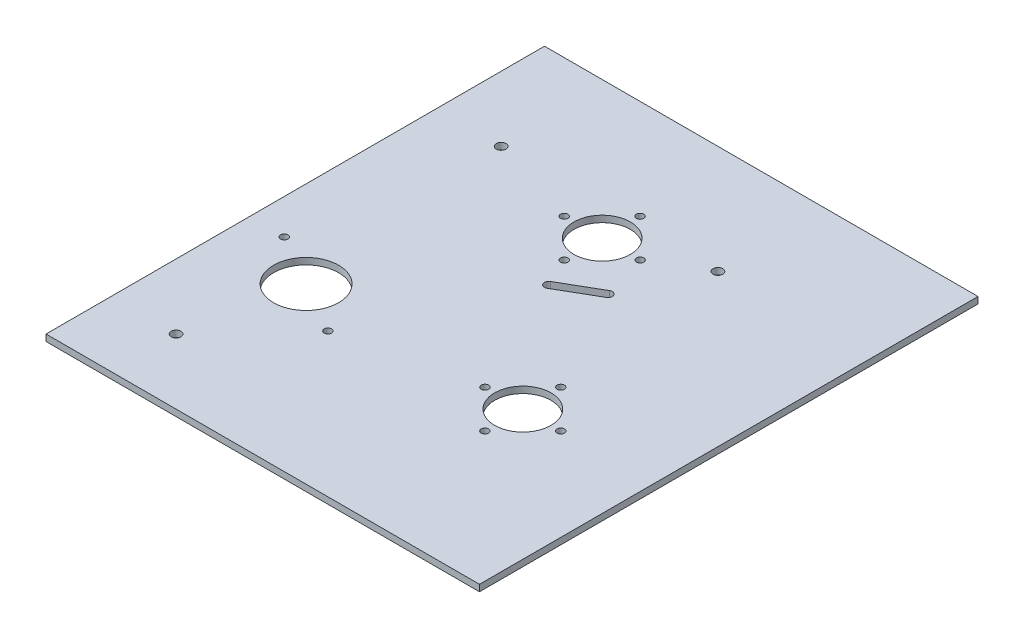
ISO-10303-21;
HEADER;
FILE_DESCRIPTION(('STEP AP214'),'2;1');
FILE_NAME('part.step','',(''),(''),'','','');
FILE_SCHEMA(('AUTOMOTIVE_DESIGN { 1 0 10303 214 1 1 1 1 }'));
ENDSEC;
DATA;
#1=APPLICATION_CONTEXT('core data for automotive mechanical design processes');
#2=APPLICATION_PROTOCOL_DEFINITION('international standard','automotive_design',2000,#1);
#3=PRODUCT_CONTEXT('',#1,'mechanical');
#4=PRODUCT('Part','Part','',(#3));
#5=PRODUCT_RELATED_PRODUCT_CATEGORY('part','',(#4));
#6=PRODUCT_DEFINITION_FORMATION('','',#4);
#7=PRODUCT_DEFINITION_CONTEXT('part definition',#1,'design');
#8=PRODUCT_DEFINITION('design','',#6,#7);
#9=PRODUCT_DEFINITION_SHAPE('','',#8);
#10=(LENGTH_UNIT() NAMED_UNIT(*) SI_UNIT(.MILLI.,.METRE.));
#11=(NAMED_UNIT(*) PLANE_ANGLE_UNIT() SI_UNIT($,.RADIAN.));
#12=(NAMED_UNIT(*) SI_UNIT($,.STERADIAN.) SOLID_ANGLE_UNIT());
#13=UNCERTAINTY_MEASURE_WITH_UNIT(LENGTH_MEASURE(1.E-05),#10,'distance_accuracy_value','');
#14=(GEOMETRIC_REPRESENTATION_CONTEXT(3) GLOBAL_UNCERTAINTY_ASSIGNED_CONTEXT((#13)) GLOBAL_UNIT_ASSIGNED_CONTEXT((#10,
#11,#12)) REPRESENTATION_CONTEXT('',''));
#15=CARTESIAN_POINT('',(0.,0.,0.));
#16=DIRECTION('',(0.,0.,1.));
#17=DIRECTION('',(1.,0.,0.));
#18=AXIS2_PLACEMENT_3D('',#15,#16,#17);
#19=CARTESIAN_POINT('',(0.,3.,0.));
#20=DIRECTION('',(0.,-1.,0.));
#21=DIRECTION('',(0.,0.,-1.));
#22=AXIS2_PLACEMENT_3D('',#19,#20,#21);
#23=PLANE('',#22);
#24=CARTESIAN_POINT('',(30.,3.,0.));
#25=DIRECTION('',(0.,1.,0.));
#26=DIRECTION('',(0.,0.,1.));
#27=AXIS2_PLACEMENT_3D('',#24,#25,#26);
#28=CIRCLE('',#27,2.24999999999999);
#29=CARTESIAN_POINT('',(30.,3.,2.24999999999999));
#30=VERTEX_POINT('',#29);
#31=EDGE_CURVE('E325',#30,#30,#28,.T.);
#32=ORIENTED_EDGE('',*,*,#31,.F.);
#33=EDGE_LOOP('',(#32));
#34=FACE_BOUND('',#33,.T.);
#35=CARTESIAN_POINT('',(16.1843013959279,3.,-63.75));
#36=DIRECTION('',(0.,1.,0.));
#37=DIRECTION('',(0.,0.,1.));
#38=AXIS2_PLACEMENT_3D('',#35,#36,#37);
#39=CIRCLE('',#38,1.69999999999999);
#40=CARTESIAN_POINT('',(16.1843013959279,3.,-62.05));
#41=VERTEX_POINT('',#40);
#42=EDGE_CURVE('E140',#41,#41,#39,.T.);
#43=ORIENTED_EDGE('',*,*,#42,.F.);
#44=EDGE_LOOP('',(#43));
#45=FACE_BOUND('',#44,.T.);
#46=CARTESIAN_POINT('',(63.8156986040721,3.,-36.25));
#47=DIRECTION('',(0.,1.,0.));
#48=DIRECTION('',(0.,0.,1.));
#49=AXIS2_PLACEMENT_3D('',#46,#47,#48);
#50=CIRCLE('',#49,1.69999999999999);
#51=CARTESIAN_POINT('',(63.8156986040721,3.,-34.55));
#52=VERTEX_POINT('',#51);
#53=EDGE_CURVE('E148',#52,#52,#50,.T.);
#54=ORIENTED_EDGE('',*,*,#53,.F.);
#55=EDGE_LOOP('',(#54));
#56=FACE_BOUND('',#55,.T.);
#57=CARTESIAN_POINT('',(140.,3.,-67.5));
#58=DIRECTION('',(0.,1.,0.));
#59=DIRECTION('',(0.,0.,1.));
#60=AXIS2_PLACEMENT_3D('',#57,#58,#59);
#61=CIRCLE('',#60,1.69999999999998);
#62=CARTESIAN_POINT('',(140.,3.,-65.8));
#63=VERTEX_POINT('',#62);
#64=EDGE_CURVE('E156',#63,#63,#61,.T.);
#65=ORIENTED_EDGE('',*,*,#64,.F.);
#66=EDGE_LOOP('',(#65));
#67=FACE_BOUND('',#66,.T.);
#68=CARTESIAN_POINT('',(122.5,3.,-50.));
#69=DIRECTION('',(0.,1.,0.));
#70=DIRECTION('',(0.,0.,1.));
#71=AXIS2_PLACEMENT_3D('',#68,#69,#70);
#72=CIRCLE('',#71,1.69999999999999);
#73=CARTESIAN_POINT('',(122.5,3.,-48.3));
#74=VERTEX_POINT('',#73);
#75=EDGE_CURVE('E164',#74,#74,#72,.T.);
#76=ORIENTED_EDGE('',*,*,#75,.F.);
#77=EDGE_LOOP('',(#76));
#78=FACE_BOUND('',#77,.T.);
#79=CARTESIAN_POINT('',(157.5,3.,-50.));
#80=DIRECTION('',(0.,1.,0.));
#81=DIRECTION('',(0.,0.,1.));
#82=AXIS2_PLACEMENT_3D('',#79,#80,#81);
#83=CIRCLE('',#82,1.69999999999998);
#84=CARTESIAN_POINT('',(157.5,3.,-48.3));
#85=VERTEX_POINT('',#84);
#86=EDGE_CURVE('E172',#85,#85,#83,.T.);
#87=ORIENTED_EDGE('',*,*,#86,.F.);
#88=EDGE_LOOP('',(#87));
#89=FACE_BOUND('',#88,.T.);
#90=CARTESIAN_POINT('',(140.,3.,-32.5));
#91=DIRECTION('',(0.,1.,0.));
#92=DIRECTION('',(0.,0.,1.));
#93=AXIS2_PLACEMENT_3D('',#90,#91,#92);
#94=CIRCLE('',#93,1.69999999999998);
#95=CARTESIAN_POINT('',(140.,3.,-30.8));
#96=VERTEX_POINT('',#95);
#97=EDGE_CURVE('E180',#96,#96,#94,.T.);
#98=ORIENTED_EDGE('',*,*,#97,.F.);
#99=EDGE_LOOP('',(#98));
#100=FACE_BOUND('',#99,.T.);
#101=CARTESIAN_POINT('',(90.,3.,-119.102540378444));
#102=DIRECTION('',(0.,1.,0.));
#103=DIRECTION('',(0.,0.,1.));
#104=AXIS2_PLACEMENT_3D('',#101,#102,#103);
#105=CIRCLE('',#104,1.69999999999999);
#106=CARTESIAN_POINT('',(90.,3.,-117.402540378444));
#107=VERTEX_POINT('',#106);
#108=EDGE_CURVE('E188',#107,#107,#105,.T.);
#109=ORIENTED_EDGE('',*,*,#108,.F.);
#110=EDGE_LOOP('',(#109));
#111=FACE_BOUND('',#110,.T.);
#112=CARTESIAN_POINT('',(72.5,3.,-136.602540378444));
#113=DIRECTION('',(0.,1.,0.));
#114=DIRECTION('',(0.,0.,1.));
#115=AXIS2_PLACEMENT_3D('',#112,#113,#114);
#116=CIRCLE('',#115,1.69999999999999);
#117=CARTESIAN_POINT('',(72.5,3.,-134.902540378444));
#118=VERTEX_POINT('',#117);
#119=EDGE_CURVE('E196',#118,#118,#116,.T.);
#120=ORIENTED_EDGE('',*,*,#119,.F.);
#121=EDGE_LOOP('',(#120));
#122=FACE_BOUND('',#121,.T.);
#123=CARTESIAN_POINT('',(107.5,3.,-136.602540378444));
#124=DIRECTION('',(0.,1.,0.));
#125=DIRECTION('',(0.,0.,1.));
#126=AXIS2_PLACEMENT_3D('',#123,#124,#125);
#127=CIRCLE('',#126,1.69999999999999);
#128=CARTESIAN_POINT('',(107.5,3.,-134.902540378444));
#129=VERTEX_POINT('',#128);
#130=EDGE_CURVE('E204',#129,#129,#127,.T.);
#131=ORIENTED_EDGE('',*,*,#130,.F.);
#132=EDGE_LOOP('',(#131));
#133=FACE_BOUND('',#132,.T.);
#134=CARTESIAN_POINT('',(90.,3.,-154.102540378444));
#135=DIRECTION('',(0.,1.,0.));
#136=DIRECTION('',(0.,0.,1.));
#137=AXIS2_PLACEMENT_3D('',#134,#135,#136);
#138=CIRCLE('',#137,1.69999999999999);
#139=CARTESIAN_POINT('',(90.,3.,-152.402540378444));
#140=VERTEX_POINT('',#139);
#141=EDGE_CURVE('E212',#140,#140,#138,.T.);
#142=ORIENTED_EDGE('',*,*,#141,.F.);
#143=EDGE_LOOP('',(#142));
#144=FACE_BOUND('',#143,.T.);
#145=CARTESIAN_POINT('',(90.,3.,-136.602540378444));
#146=DIRECTION('',(0.,1.,0.));
#147=DIRECTION('',(0.,0.,1.));
#148=AXIS2_PLACEMENT_3D('',#145,#146,#147);
#149=CIRCLE('',#148,13.);
#150=CARTESIAN_POINT('',(90.,3.,-123.602540378444));
#151=VERTEX_POINT('',#150);
#152=EDGE_CURVE('E225',#151,#151,#149,.T.);
#153=ORIENTED_EDGE('',*,*,#152,.F.);
#154=EDGE_LOOP('',(#153));
#155=FACE_BOUND('',#154,.T.);
#156=CARTESIAN_POINT('',(140.,3.,-50.));
#157=DIRECTION('',(0.,1.,0.));
#158=DIRECTION('',(0.,0.,1.));
#159=AXIS2_PLACEMENT_3D('',#156,#157,#158);
#160=CIRCLE('',#159,13.);
#161=CARTESIAN_POINT('',(140.,3.,-37.));
#162=VERTEX_POINT('',#161);
#163=EDGE_CURVE('E233',#162,#162,#160,.T.);
#164=ORIENTED_EDGE('',*,*,#163,.F.);
#165=EDGE_LOOP('',(#164));
#166=FACE_BOUND('',#165,.T.);
#167=DIRECTION('',(0.866025403784438,0.,-0.500000000000001));
#168=VECTOR('',#167,1.);
#169=CARTESIAN_POINT('',(97.3397459621556,3.,-103.889727457342));
#170=LINE('',#169,#168);
#171=CARTESIAN_POINT('',(97.3397459621556,3.,-103.889727457342));
#172=VERTEX_POINT('',#171);
#173=CARTESIAN_POINT('',(114.660254037844,3.,-113.889727457342));
#174=VERTEX_POINT('',#173);
#175=EDGE_CURVE('E256',#172,#174,#170,.T.);
#176=ORIENTED_EDGE('',*,*,#175,.F.);
#177=CARTESIAN_POINT('',(96.3397459621556,3.,-105.621778264911));
#178=DIRECTION('',(0.,1.,0.));
#179=DIRECTION('',(0.,0.,1.));
#180=AXIS2_PLACEMENT_3D('',#177,#178,#179);
#181=CIRCLE('',#180,2.00000000000001);
#182=CARTESIAN_POINT('',(95.3397459621556,3.,-107.35382907248));
#183=VERTEX_POINT('',#182);
#184=EDGE_CURVE('E55',#183,#172,#181,.T.);
#185=ORIENTED_EDGE('',*,*,#184,.F.);
#186=DIRECTION('',(-0.866025403784438,0.,0.5));
#187=VECTOR('',#186,1.);
#188=CARTESIAN_POINT('',(95.3397459621556,3.,-107.35382907248));
#189=LINE('',#188,#187);
#190=CARTESIAN_POINT('',(112.660254037844,3.,-117.35382907248));
#191=VERTEX_POINT('',#190);
#192=EDGE_CURVE('E243',#191,#183,#189,.T.);
#193=ORIENTED_EDGE('',*,*,#192,.F.);
#194=CARTESIAN_POINT('',(113.660254037844,3.,-115.621778264911));
#195=DIRECTION('',(0.,1.,0.));
#196=DIRECTION('',(0.,0.,1.));
#197=AXIS2_PLACEMENT_3D('',#194,#195,#196);
#198=CIRCLE('',#197,2.00000000000001);
#199=EDGE_CURVE('E261',#174,#191,#198,.T.);
#200=ORIENTED_EDGE('',*,*,#199,.F.);
#201=EDGE_LOOP('',(#176,#185,#193,#200));
#202=FACE_BOUND('',#201,.T.);
#203=CARTESIAN_POINT('',(40.,3.,-50.));
#204=DIRECTION('',(0.,1.,0.));
#205=DIRECTION('',(0.,0.,1.));
#206=AXIS2_PLACEMENT_3D('',#203,#204,#205);
#207=CIRCLE('',#206,15.);
#208=CARTESIAN_POINT('',(40.,3.,-35.));
#209=VERTEX_POINT('',#208);
#210=EDGE_CURVE('E220',#209,#209,#207,.T.);
#211=ORIENTED_EDGE('',*,*,#210,.F.);
#212=EDGE_LOOP('',(#211));
#213=FACE_BOUND('',#212,.T.);
#214=DIRECTION('',(0.,0.,1.));
#215=VECTOR('',#214,1.);
#216=CARTESIAN_POINT('',(0.,3.,0.));
#217=LINE('',#216,#215);
#218=CARTESIAN_POINT('',(0.,3.,-200.));
#219=VERTEX_POINT('',#218);
#220=CARTESIAN_POINT('',(0.,3.,30.));
#221=VERTEX_POINT('',#220);
#222=EDGE_CURVE('E284',#219,#221,#217,.T.);
#223=ORIENTED_EDGE('',*,*,#222,.T.);
#224=DIRECTION('',(1.,0.,0.));
#225=VECTOR('',#224,1.);
#226=CARTESIAN_POINT('',(0.,3.,30.));
#227=LINE('',#226,#225);
#228=CARTESIAN_POINT('',(200.,3.,30.));
#229=VERTEX_POINT('',#228);
#230=EDGE_CURVE('E131',#221,#229,#227,.T.);
#231=ORIENTED_EDGE('',*,*,#230,.T.);
#232=DIRECTION('',(0.,0.,-1.));
#233=VECTOR('',#232,1.);
#234=CARTESIAN_POINT('',(200.,3.,0.));
#235=LINE('',#234,#233);
#236=CARTESIAN_POINT('',(200.,3.,-200.));
#237=VERTEX_POINT('',#236);
#238=EDGE_CURVE('E121',#229,#237,#235,.T.);
#239=ORIENTED_EDGE('',*,*,#238,.T.);
#240=DIRECTION('',(-1.,0.,0.));
#241=VECTOR('',#240,1.);
#242=CARTESIAN_POINT('',(0.,3.,-200.));
#243=LINE('',#242,#241);
#244=EDGE_CURVE('E289',#237,#219,#243,.T.);
#245=ORIENTED_EDGE('',*,*,#244,.T.);
#246=EDGE_LOOP('',(#223,#231,#239,#245));
#247=FACE_BOUND('',#246,.T.);
#248=CARTESIAN_POINT('',(130.,3.,-150.));
#249=DIRECTION('',(0.,1.,0.));
#250=DIRECTION('',(0.,0.,1.));
#251=AXIS2_PLACEMENT_3D('',#248,#249,#250);
#252=CIRCLE('',#251,2.25);
#253=CARTESIAN_POINT('',(130.,3.,-147.75));
#254=VERTEX_POINT('',#253);
#255=EDGE_CURVE('E311',#254,#254,#252,.T.);
#256=ORIENTED_EDGE('',*,*,#255,.F.);
#257=EDGE_LOOP('',(#256));
#258=FACE_BOUND('',#257,.T.);
#259=CARTESIAN_POINT('',(30.,3.,-150.));
#260=DIRECTION('',(0.,1.,0.));
#261=DIRECTION('',(0.,0.,1.));
#262=AXIS2_PLACEMENT_3D('',#259,#260,#261);
#263=CIRCLE('',#262,2.24999999999999);
#264=CARTESIAN_POINT('',(30.,3.,-147.75));
#265=VERTEX_POINT('',#264);
#266=EDGE_CURVE('E314',#265,#265,#263,.T.);
#267=ORIENTED_EDGE('',*,*,#266,.F.);
#268=EDGE_LOOP('',(#267));
#269=FACE_BOUND('',#268,.T.);
#270=ADVANCED_FACE('F39',(#34,#45,#56,#67,#78,#89,#100,#111,#122,#133,#144,#155,#166,#202,#213,
#247,#258,#269),#23,.F.);
#271=CARTESIAN_POINT('',(0.,3.,0.));
#272=DIRECTION('',(1.,0.,0.));
#273=DIRECTION('',(0.,0.,-1.));
#274=AXIS2_PLACEMENT_3D('',#271,#272,#273);
#275=PLANE('',#274);
#276=DIRECTION('',(0.,0.,1.));
#277=VECTOR('',#276,1.);
#278=CARTESIAN_POINT('',(0.,0.,0.));
#279=LINE('',#278,#277);
#280=CARTESIAN_POINT('',(0.,0.,-200.));
#281=VERTEX_POINT('',#280);
#282=CARTESIAN_POINT('',(0.,0.,30.));
#283=VERTEX_POINT('',#282);
#284=EDGE_CURVE('E116',#281,#283,#279,.T.);
#285=ORIENTED_EDGE('',*,*,#284,.T.);
#286=DIRECTION('',(0.,1.,0.));
#287=VECTOR('',#286,1.);
#288=CARTESIAN_POINT('',(0.,-202.237484161567,30.));
#289=LINE('',#288,#287);
#290=EDGE_CURVE('E126',#283,#221,#289,.T.);
#291=ORIENTED_EDGE('',*,*,#290,.T.);
#292=ORIENTED_EDGE('',*,*,#222,.F.);
#293=DIRECTION('',(0.,-1.,0.));
#294=VECTOR('',#293,1.);
#295=CARTESIAN_POINT('',(0.,3.,-200.));
#296=LINE('',#295,#294);
#297=EDGE_CURVE('E48',#219,#281,#296,.T.);
#298=ORIENTED_EDGE('',*,*,#297,.T.);
#299=EDGE_LOOP('',(#285,#291,#292,#298));
#300=FACE_BOUND('',#299,.T.);
#301=ADVANCED_FACE('F41',(#300),#275,.F.);
#302=CARTESIAN_POINT('',(200.,3.,0.));
#303=DIRECTION('',(-1.,0.,0.));
#304=DIRECTION('',(0.,0.,1.));
#305=AXIS2_PLACEMENT_3D('',#302,#303,#304);
#306=PLANE('',#305);
#307=DIRECTION('',(0.,0.,-1.));
#308=VECTOR('',#307,1.);
#309=CARTESIAN_POINT('',(200.,0.,0.));
#310=LINE('',#309,#308);
#311=CARTESIAN_POINT('',(200.,0.,30.));
#312=VERTEX_POINT('',#311);
#313=CARTESIAN_POINT('',(200.,0.,-200.));
#314=VERTEX_POINT('',#313);
#315=EDGE_CURVE('E105',#312,#314,#310,.T.);
#316=ORIENTED_EDGE('',*,*,#315,.T.);
#317=DIRECTION('',(0.,-1.,0.));
#318=VECTOR('',#317,1.);
#319=CARTESIAN_POINT('',(200.,3.,-200.));
#320=LINE('',#319,#318);
#321=EDGE_CURVE('E11',#237,#314,#320,.T.);
#322=ORIENTED_EDGE('',*,*,#321,.F.);
#323=ORIENTED_EDGE('',*,*,#238,.F.);
#324=DIRECTION('',(0.,1.,0.));
#325=VECTOR('',#324,1.);
#326=CARTESIAN_POINT('',(200.,-202.237484161567,30.));
#327=LINE('',#326,#325);
#328=EDGE_CURVE('E119',#312,#229,#327,.T.);
#329=ORIENTED_EDGE('',*,*,#328,.F.);
#330=EDGE_LOOP('',(#316,#322,#323,#329));
#331=FACE_BOUND('',#330,.T.);
#332=ADVANCED_FACE('F120',(#331),#306,.F.);
#333=CARTESIAN_POINT('',(0.,3.,-200.));
#334=DIRECTION('',(0.,0.,1.));
#335=DIRECTION('',(1.,0.,0.));
#336=AXIS2_PLACEMENT_3D('',#333,#334,#335);
#337=PLANE('',#336);
#338=DIRECTION('',(-1.,0.,0.));
#339=VECTOR('',#338,1.);
#340=CARTESIAN_POINT('',(0.,0.,-200.));
#341=LINE('',#340,#339);
#342=EDGE_CURVE('E112',#314,#281,#341,.T.);
#343=ORIENTED_EDGE('',*,*,#342,.T.);
#344=ORIENTED_EDGE('',*,*,#297,.F.);
#345=ORIENTED_EDGE('',*,*,#244,.F.);
#346=ORIENTED_EDGE('',*,*,#321,.T.);
#347=EDGE_LOOP('',(#343,#344,#345,#346));
#348=FACE_BOUND('',#347,.T.);
#349=ADVANCED_FACE('F302',(#348),#337,.F.);
#350=CARTESIAN_POINT('',(0.,0.,0.));
#351=DIRECTION('',(0.,-1.,0.));
#352=DIRECTION('',(0.,0.,-1.));
#353=AXIS2_PLACEMENT_3D('',#350,#351,#352);
#354=PLANE('',#353);
#355=CARTESIAN_POINT('',(30.,0.,0.));
#356=DIRECTION('',(0.,-1.,0.));
#357=DIRECTION('',(0.,0.,-1.));
#358=AXIS2_PLACEMENT_3D('',#355,#356,#357);
#359=CIRCLE('',#358,2.24999999999999);
#360=CARTESIAN_POINT('',(30.,0.,-2.24999999999999));
#361=VERTEX_POINT('',#360);
#362=EDGE_CURVE('E318',#361,#361,#359,.T.);
#363=ORIENTED_EDGE('',*,*,#362,.F.);
#364=EDGE_LOOP('',(#363));
#365=FACE_BOUND('',#364,.T.);
#366=CARTESIAN_POINT('',(30.,0.,-150.));
#367=DIRECTION('',(0.,-1.,0.));
#368=DIRECTION('',(0.,0.,-1.));
#369=AXIS2_PLACEMENT_3D('',#366,#367,#368);
#370=CIRCLE('',#369,2.24999999999999);
#371=CARTESIAN_POINT('',(30.,0.,-152.25));
#372=VERTEX_POINT('',#371);
#373=EDGE_CURVE('E317',#372,#372,#370,.T.);
#374=ORIENTED_EDGE('',*,*,#373,.F.);
#375=EDGE_LOOP('',(#374));
#376=FACE_BOUND('',#375,.T.);
#377=CARTESIAN_POINT('',(130.,0.,-150.));
#378=DIRECTION('',(0.,-1.,0.));
#379=DIRECTION('',(0.,0.,-1.));
#380=AXIS2_PLACEMENT_3D('',#377,#378,#379);
#381=CIRCLE('',#380,2.24999999999999);
#382=CARTESIAN_POINT('',(130.,0.,-152.25));
#383=VERTEX_POINT('',#382);
#384=EDGE_CURVE('E134',#383,#383,#381,.T.);
#385=ORIENTED_EDGE('',*,*,#384,.F.);
#386=EDGE_LOOP('',(#385));
#387=FACE_BOUND('',#386,.T.);
#388=CARTESIAN_POINT('',(16.1843013959279,0.,-63.75));
#389=DIRECTION('',(0.,1.,0.));
#390=DIRECTION('',(0.,0.,1.));
#391=AXIS2_PLACEMENT_3D('',#388,#389,#390);
#392=CIRCLE('',#391,1.69999999999999);
#393=CARTESIAN_POINT('',(16.1843013959279,0.,-62.05));
#394=VERTEX_POINT('',#393);
#395=EDGE_CURVE('E144',#394,#394,#392,.T.);
#396=ORIENTED_EDGE('',*,*,#395,.T.);
#397=EDGE_LOOP('',(#396));
#398=FACE_BOUND('',#397,.T.);
#399=CARTESIAN_POINT('',(63.8156986040721,0.,-36.25));
#400=DIRECTION('',(0.,1.,0.));
#401=DIRECTION('',(0.,0.,1.));
#402=AXIS2_PLACEMENT_3D('',#399,#400,#401);
#403=CIRCLE('',#402,1.69999999999999);
#404=CARTESIAN_POINT('',(63.8156986040721,0.,-34.55));
#405=VERTEX_POINT('',#404);
#406=EDGE_CURVE('E152',#405,#405,#403,.T.);
#407=ORIENTED_EDGE('',*,*,#406,.T.);
#408=EDGE_LOOP('',(#407));
#409=FACE_BOUND('',#408,.T.);
#410=CARTESIAN_POINT('',(140.,0.,-67.5));
#411=DIRECTION('',(0.,1.,0.));
#412=DIRECTION('',(0.,0.,1.));
#413=AXIS2_PLACEMENT_3D('',#410,#411,#412);
#414=CIRCLE('',#413,1.69999999999998);
#415=CARTESIAN_POINT('',(140.,0.,-65.8));
#416=VERTEX_POINT('',#415);
#417=EDGE_CURVE('E160',#416,#416,#414,.T.);
#418=ORIENTED_EDGE('',*,*,#417,.T.);
#419=EDGE_LOOP('',(#418));
#420=FACE_BOUND('',#419,.T.);
#421=CARTESIAN_POINT('',(122.5,0.,-50.));
#422=DIRECTION('',(0.,1.,0.));
#423=DIRECTION('',(0.,0.,1.));
#424=AXIS2_PLACEMENT_3D('',#421,#422,#423);
#425=CIRCLE('',#424,1.69999999999999);
#426=CARTESIAN_POINT('',(122.5,0.,-48.3));
#427=VERTEX_POINT('',#426);
#428=EDGE_CURVE('E168',#427,#427,#425,.T.);
#429=ORIENTED_EDGE('',*,*,#428,.T.);
#430=EDGE_LOOP('',(#429));
#431=FACE_BOUND('',#430,.T.);
#432=CARTESIAN_POINT('',(157.5,0.,-50.));
#433=DIRECTION('',(0.,1.,0.));
#434=DIRECTION('',(0.,0.,1.));
#435=AXIS2_PLACEMENT_3D('',#432,#433,#434);
#436=CIRCLE('',#435,1.69999999999998);
#437=CARTESIAN_POINT('',(157.5,0.,-48.3));
#438=VERTEX_POINT('',#437);
#439=EDGE_CURVE('E176',#438,#438,#436,.T.);
#440=ORIENTED_EDGE('',*,*,#439,.T.);
#441=EDGE_LOOP('',(#440));
#442=FACE_BOUND('',#441,.T.);
#443=CARTESIAN_POINT('',(140.,0.,-32.5));
#444=DIRECTION('',(0.,1.,0.));
#445=DIRECTION('',(0.,0.,1.));
#446=AXIS2_PLACEMENT_3D('',#443,#444,#445);
#447=CIRCLE('',#446,1.69999999999998);
#448=CARTESIAN_POINT('',(140.,0.,-30.8));
#449=VERTEX_POINT('',#448);
#450=EDGE_CURVE('E184',#449,#449,#447,.T.);
#451=ORIENTED_EDGE('',*,*,#450,.T.);
#452=EDGE_LOOP('',(#451));
#453=FACE_BOUND('',#452,.T.);
#454=CARTESIAN_POINT('',(90.,0.,-119.102540378444));
#455=DIRECTION('',(0.,1.,0.));
#456=DIRECTION('',(0.,0.,1.));
#457=AXIS2_PLACEMENT_3D('',#454,#455,#456);
#458=CIRCLE('',#457,1.69999999999999);
#459=CARTESIAN_POINT('',(90.,0.,-117.402540378444));
#460=VERTEX_POINT('',#459);
#461=EDGE_CURVE('E192',#460,#460,#458,.T.);
#462=ORIENTED_EDGE('',*,*,#461,.T.);
#463=EDGE_LOOP('',(#462));
#464=FACE_BOUND('',#463,.T.);
#465=CARTESIAN_POINT('',(72.5,0.,-136.602540378444));
#466=DIRECTION('',(0.,1.,0.));
#467=DIRECTION('',(0.,0.,1.));
#468=AXIS2_PLACEMENT_3D('',#465,#466,#467);
#469=CIRCLE('',#468,1.69999999999999);
#470=CARTESIAN_POINT('',(72.5,0.,-134.902540378444));
#471=VERTEX_POINT('',#470);
#472=EDGE_CURVE('E200',#471,#471,#469,.T.);
#473=ORIENTED_EDGE('',*,*,#472,.T.);
#474=EDGE_LOOP('',(#473));
#475=FACE_BOUND('',#474,.T.);
#476=CARTESIAN_POINT('',(107.5,0.,-136.602540378444));
#477=DIRECTION('',(0.,1.,0.));
#478=DIRECTION('',(0.,0.,1.));
#479=AXIS2_PLACEMENT_3D('',#476,#477,#478);
#480=CIRCLE('',#479,1.69999999999999);
#481=CARTESIAN_POINT('',(107.5,0.,-134.902540378444));
#482=VERTEX_POINT('',#481);
#483=EDGE_CURVE('E208',#482,#482,#480,.T.);
#484=ORIENTED_EDGE('',*,*,#483,.T.);
#485=EDGE_LOOP('',(#484));
#486=FACE_BOUND('',#485,.T.);
#487=CARTESIAN_POINT('',(90.,0.,-154.102540378444));
#488=DIRECTION('',(0.,1.,0.));
#489=DIRECTION('',(0.,0.,1.));
#490=AXIS2_PLACEMENT_3D('',#487,#488,#489);
#491=CIRCLE('',#490,1.69999999999999);
#492=CARTESIAN_POINT('',(90.,0.,-152.402540378444));
#493=VERTEX_POINT('',#492);
#494=EDGE_CURVE('E216',#493,#493,#491,.T.);
#495=ORIENTED_EDGE('',*,*,#494,.T.);
#496=EDGE_LOOP('',(#495));
#497=FACE_BOUND('',#496,.T.);
#498=CARTESIAN_POINT('',(90.,0.,-136.602540378444));
#499=DIRECTION('',(0.,1.,0.));
#500=DIRECTION('',(0.,0.,1.));
#501=AXIS2_PLACEMENT_3D('',#498,#499,#500);
#502=CIRCLE('',#501,13.);
#503=CARTESIAN_POINT('',(90.,0.,-123.602540378444));
#504=VERTEX_POINT('',#503);
#505=EDGE_CURVE('E221',#504,#504,#502,.T.);
#506=ORIENTED_EDGE('',*,*,#505,.T.);
#507=EDGE_LOOP('',(#506));
#508=FACE_BOUND('',#507,.T.);
#509=CARTESIAN_POINT('',(140.,0.,-50.));
#510=DIRECTION('',(0.,1.,0.));
#511=DIRECTION('',(0.,0.,1.));
#512=AXIS2_PLACEMENT_3D('',#509,#510,#511);
#513=CIRCLE('',#512,13.);
#514=CARTESIAN_POINT('',(140.,0.,-37.));
#515=VERTEX_POINT('',#514);
#516=EDGE_CURVE('E229',#515,#515,#513,.T.);
#517=ORIENTED_EDGE('',*,*,#516,.T.);
#518=EDGE_LOOP('',(#517));
#519=FACE_BOUND('',#518,.T.);
#520=CARTESIAN_POINT('',(96.3397459621556,0.,-105.621778264911));
#521=DIRECTION('',(0.,1.,0.));
#522=DIRECTION('',(0.,0.,1.));
#523=AXIS2_PLACEMENT_3D('',#520,#521,#522);
#524=CIRCLE('',#523,2.00000000000001);
#525=CARTESIAN_POINT('',(95.3397459621556,0.,-107.35382907248));
#526=VERTEX_POINT('',#525);
#527=CARTESIAN_POINT('',(97.3397459621556,0.,-103.889727457342));
#528=VERTEX_POINT('',#527);
#529=EDGE_CURVE('E238',#526,#528,#524,.T.);
#530=ORIENTED_EDGE('',*,*,#529,.T.);
#531=DIRECTION('',(0.866025403784438,0.,-0.500000000000001));
#532=VECTOR('',#531,1.);
#533=CARTESIAN_POINT('',(97.3397459621556,0.,-103.889727457342));
#534=LINE('',#533,#532);
#535=CARTESIAN_POINT('',(114.660254037844,0.,-113.889727457342));
#536=VERTEX_POINT('',#535);
#537=EDGE_CURVE('E242',#528,#536,#534,.T.);
#538=ORIENTED_EDGE('',*,*,#537,.T.);
#539=CARTESIAN_POINT('',(113.660254037844,0.,-115.621778264911));
#540=DIRECTION('',(0.,1.,0.));
#541=DIRECTION('',(0.,0.,1.));
#542=AXIS2_PLACEMENT_3D('',#539,#540,#541);
#543=CIRCLE('',#542,2.00000000000001);
#544=CARTESIAN_POINT('',(112.660254037844,0.,-117.35382907248));
#545=VERTEX_POINT('',#544);
#546=EDGE_CURVE('E63',#536,#545,#543,.T.);
#547=ORIENTED_EDGE('',*,*,#546,.T.);
#548=DIRECTION('',(-0.866025403784438,0.,0.5));
#549=VECTOR('',#548,1.);
#550=CARTESIAN_POINT('',(95.3397459621556,0.,-107.35382907248));
#551=LINE('',#550,#549);
#552=EDGE_CURVE('E249',#545,#526,#551,.T.);
#553=ORIENTED_EDGE('',*,*,#552,.T.);
#554=EDGE_LOOP('',(#530,#538,#547,#553));
#555=FACE_BOUND('',#554,.T.);
#556=CARTESIAN_POINT('',(40.,0.,-50.));
#557=DIRECTION('',(0.,1.,0.));
#558=DIRECTION('',(0.,0.,1.));
#559=AXIS2_PLACEMENT_3D('',#556,#557,#558);
#560=CIRCLE('',#559,15.);
#561=CARTESIAN_POINT('',(40.,0.,-35.));
#562=VERTEX_POINT('',#561);
#563=EDGE_CURVE('E257',#562,#562,#560,.T.);
#564=ORIENTED_EDGE('',*,*,#563,.T.);
#565=EDGE_LOOP('',(#564));
#566=FACE_BOUND('',#565,.T.);
#567=ORIENTED_EDGE('',*,*,#284,.F.);
#568=ORIENTED_EDGE('',*,*,#342,.F.);
#569=ORIENTED_EDGE('',*,*,#315,.F.);
#570=DIRECTION('',(1.,0.,0.));
#571=VECTOR('',#570,1.);
#572=CARTESIAN_POINT('',(0.,0.,30.));
#573=LINE('',#572,#571);
#574=EDGE_CURVE('E110',#283,#312,#573,.T.);
#575=ORIENTED_EDGE('',*,*,#574,.F.);
#576=EDGE_LOOP('',(#567,#568,#569,#575));
#577=FACE_BOUND('',#576,.T.);
#578=ADVANCED_FACE('F108',(#365,#376,#387,#398,#409,#420,#431,#442,#453,#464,#475,#486,#497,
#508,#519,#555,#566,#577),#354,.T.);
#579=CARTESIAN_POINT('',(40.,0.,-50.));
#580=DIRECTION('',(0.,1.,0.));
#581=DIRECTION('',(0.,0.,1.));
#582=AXIS2_PLACEMENT_3D('',#579,#580,#581);
#583=CYLINDRICAL_SURFACE('',#582,15.);
#584=ORIENTED_EDGE('',*,*,#563,.F.);
#585=EDGE_LOOP('',(#584));
#586=FACE_BOUND('',#585,.T.);
#587=ORIENTED_EDGE('',*,*,#210,.T.);
#588=EDGE_LOOP('',(#587));
#589=FACE_BOUND('',#588,.T.);
#590=ADVANCED_FACE('F339',(#586,#589),#583,.F.);
#591=CARTESIAN_POINT('',(96.3397459621556,0.,-105.621778264911));
#592=DIRECTION('',(0.,1.,0.));
#593=DIRECTION('',(0.,0.,1.));
#594=AXIS2_PLACEMENT_3D('',#591,#592,#593);
#595=CYLINDRICAL_SURFACE('',#594,2.00000000000001);
#596=ORIENTED_EDGE('',*,*,#184,.T.);
#597=DIRECTION('',(0.,1.,0.));
#598=VECTOR('',#597,1.);
#599=CARTESIAN_POINT('',(97.3397459621556,0.,-103.889727457342));
#600=LINE('',#599,#598);
#601=EDGE_CURVE('E253',#528,#172,#600,.T.);
#602=ORIENTED_EDGE('',*,*,#601,.F.);
#603=ORIENTED_EDGE('',*,*,#529,.F.);
#604=DIRECTION('',(0.,1.,0.));
#605=VECTOR('',#604,1.);
#606=CARTESIAN_POINT('',(95.3397459621556,0.,-107.35382907248));
#607=LINE('',#606,#605);
#608=EDGE_CURVE('E237',#526,#183,#607,.T.);
#609=ORIENTED_EDGE('',*,*,#608,.T.);
#610=EDGE_LOOP('',(#596,#602,#603,#609));
#611=FACE_BOUND('',#610,.T.);
#612=ADVANCED_FACE('F372',(#611),#595,.F.);
#613=CARTESIAN_POINT('',(95.3397459621556,0.,-107.35382907248));
#614=DIRECTION('',(-0.5,0.,-0.866025403784438));
#615=DIRECTION('',(-0.866025403784439,0.,0.5));
#616=AXIS2_PLACEMENT_3D('',#613,#614,#615);
#617=PLANE('',#616);
#618=ORIENTED_EDGE('',*,*,#192,.T.);
#619=ORIENTED_EDGE('',*,*,#608,.F.);
#620=ORIENTED_EDGE('',*,*,#552,.F.);
#621=DIRECTION('',(0.,1.,0.));
#622=VECTOR('',#621,1.);
#623=CARTESIAN_POINT('',(112.660254037844,0.,-117.35382907248));
#624=LINE('',#623,#622);
#625=EDGE_CURVE('E270',#545,#191,#624,.T.);
#626=ORIENTED_EDGE('',*,*,#625,.T.);
#627=EDGE_LOOP('',(#618,#619,#620,#626));
#628=FACE_BOUND('',#627,.T.);
#629=ADVANCED_FACE('F380',(#628),#617,.F.);
#630=CARTESIAN_POINT('',(113.660254037844,0.,-115.621778264911));
#631=DIRECTION('',(0.,1.,0.));
#632=DIRECTION('',(0.,0.,1.));
#633=AXIS2_PLACEMENT_3D('',#630,#631,#632);
#634=CYLINDRICAL_SURFACE('',#633,2.00000000000001);
#635=ORIENTED_EDGE('',*,*,#199,.T.);
#636=ORIENTED_EDGE('',*,*,#625,.F.);
#637=ORIENTED_EDGE('',*,*,#546,.F.);
#638=DIRECTION('',(0.,1.,0.));
#639=VECTOR('',#638,1.);
#640=CARTESIAN_POINT('',(114.660254037844,0.,-113.889727457342));
#641=LINE('',#640,#639);
#642=EDGE_CURVE('E273',#536,#174,#641,.T.);
#643=ORIENTED_EDGE('',*,*,#642,.T.);
#644=EDGE_LOOP('',(#635,#636,#637,#643));
#645=FACE_BOUND('',#644,.T.);
#646=ADVANCED_FACE('F499',(#645),#634,.F.);
#647=CARTESIAN_POINT('',(97.3397459621556,0.,-103.889727457342));
#648=DIRECTION('',(0.500000000000001,0.,0.866025403784438));
#649=DIRECTION('',(0.866025403784438,0.,-0.500000000000001));
#650=AXIS2_PLACEMENT_3D('',#647,#648,#649);
#651=PLANE('',#650);
#652=ORIENTED_EDGE('',*,*,#175,.T.);
#653=ORIENTED_EDGE('',*,*,#642,.F.);
#654=ORIENTED_EDGE('',*,*,#537,.F.);
#655=ORIENTED_EDGE('',*,*,#601,.T.);
#656=EDGE_LOOP('',(#652,#653,#654,#655));
#657=FACE_BOUND('',#656,.T.);
#658=ADVANCED_FACE('F491',(#657),#651,.F.);
#659=CARTESIAN_POINT('',(140.,0.,-50.));
#660=DIRECTION('',(0.,1.,0.));
#661=DIRECTION('',(0.,0.,1.));
#662=AXIS2_PLACEMENT_3D('',#659,#660,#661);
#663=CYLINDRICAL_SURFACE('',#662,13.);
#664=ORIENTED_EDGE('',*,*,#516,.F.);
#665=EDGE_LOOP('',(#664));
#666=FACE_BOUND('',#665,.T.);
#667=ORIENTED_EDGE('',*,*,#163,.T.);
#668=EDGE_LOOP('',(#667));
#669=FACE_BOUND('',#668,.T.);
#670=ADVANCED_FACE('F483',(#666,#669),#663,.F.);
#671=CARTESIAN_POINT('',(90.,0.,-136.602540378444));
#672=DIRECTION('',(0.,1.,0.));
#673=DIRECTION('',(0.,0.,1.));
#674=AXIS2_PLACEMENT_3D('',#671,#672,#673);
#675=CYLINDRICAL_SURFACE('',#674,13.);
#676=ORIENTED_EDGE('',*,*,#505,.F.);
#677=EDGE_LOOP('',(#676));
#678=FACE_BOUND('',#677,.T.);
#679=ORIENTED_EDGE('',*,*,#152,.T.);
#680=EDGE_LOOP('',(#679));
#681=FACE_BOUND('',#680,.T.);
#682=ADVANCED_FACE('F475',(#678,#681),#675,.F.);
#683=CARTESIAN_POINT('',(90.,3.,-154.102540378444));
#684=DIRECTION('',(0.,1.,0.));
#685=DIRECTION('',(0.,0.,1.));
#686=AXIS2_PLACEMENT_3D('',#683,#684,#685);
#687=CYLINDRICAL_SURFACE('',#686,1.69999999999999);
#688=ORIENTED_EDGE('',*,*,#494,.F.);
#689=EDGE_LOOP('',(#688));
#690=FACE_BOUND('',#689,.T.);
#691=ORIENTED_EDGE('',*,*,#141,.T.);
#692=EDGE_LOOP('',(#691));
#693=FACE_BOUND('',#692,.T.);
#694=ADVANCED_FACE('F467',(#690,#693),#687,.F.);
#695=CARTESIAN_POINT('',(107.5,3.,-136.602540378444));
#696=DIRECTION('',(0.,1.,0.));
#697=DIRECTION('',(0.,0.,1.));
#698=AXIS2_PLACEMENT_3D('',#695,#696,#697);
#699=CYLINDRICAL_SURFACE('',#698,1.69999999999999);
#700=ORIENTED_EDGE('',*,*,#483,.F.);
#701=EDGE_LOOP('',(#700));
#702=FACE_BOUND('',#701,.T.);
#703=ORIENTED_EDGE('',*,*,#130,.T.);
#704=EDGE_LOOP('',(#703));
#705=FACE_BOUND('',#704,.T.);
#706=ADVANCED_FACE('F459',(#702,#705),#699,.F.);
#707=CARTESIAN_POINT('',(72.5,3.,-136.602540378444));
#708=DIRECTION('',(0.,1.,0.));
#709=DIRECTION('',(0.,0.,1.));
#710=AXIS2_PLACEMENT_3D('',#707,#708,#709);
#711=CYLINDRICAL_SURFACE('',#710,1.69999999999999);
#712=ORIENTED_EDGE('',*,*,#472,.F.);
#713=EDGE_LOOP('',(#712));
#714=FACE_BOUND('',#713,.T.);
#715=ORIENTED_EDGE('',*,*,#119,.T.);
#716=EDGE_LOOP('',(#715));
#717=FACE_BOUND('',#716,.T.);
#718=ADVANCED_FACE('F451',(#714,#717),#711,.F.);
#719=CARTESIAN_POINT('',(90.,3.,-119.102540378444));
#720=DIRECTION('',(0.,1.,0.));
#721=DIRECTION('',(0.,0.,1.));
#722=AXIS2_PLACEMENT_3D('',#719,#720,#721);
#723=CYLINDRICAL_SURFACE('',#722,1.69999999999999);
#724=ORIENTED_EDGE('',*,*,#461,.F.);
#725=EDGE_LOOP('',(#724));
#726=FACE_BOUND('',#725,.T.);
#727=ORIENTED_EDGE('',*,*,#108,.T.);
#728=EDGE_LOOP('',(#727));
#729=FACE_BOUND('',#728,.T.);
#730=ADVANCED_FACE('F443',(#726,#729),#723,.F.);
#731=CARTESIAN_POINT('',(140.,3.,-32.5));
#732=DIRECTION('',(0.,1.,0.));
#733=DIRECTION('',(0.,0.,1.));
#734=AXIS2_PLACEMENT_3D('',#731,#732,#733);
#735=CYLINDRICAL_SURFACE('',#734,1.69999999999998);
#736=ORIENTED_EDGE('',*,*,#450,.F.);
#737=EDGE_LOOP('',(#736));
#738=FACE_BOUND('',#737,.T.);
#739=ORIENTED_EDGE('',*,*,#97,.T.);
#740=EDGE_LOOP('',(#739));
#741=FACE_BOUND('',#740,.T.);
#742=ADVANCED_FACE('F435',(#738,#741),#735,.F.);
#743=CARTESIAN_POINT('',(157.5,3.,-50.));
#744=DIRECTION('',(0.,1.,0.));
#745=DIRECTION('',(0.,0.,1.));
#746=AXIS2_PLACEMENT_3D('',#743,#744,#745);
#747=CYLINDRICAL_SURFACE('',#746,1.69999999999998);
#748=ORIENTED_EDGE('',*,*,#439,.F.);
#749=EDGE_LOOP('',(#748));
#750=FACE_BOUND('',#749,.T.);
#751=ORIENTED_EDGE('',*,*,#86,.T.);
#752=EDGE_LOOP('',(#751));
#753=FACE_BOUND('',#752,.T.);
#754=ADVANCED_FACE('F427',(#750,#753),#747,.F.);
#755=CARTESIAN_POINT('',(122.5,3.,-50.));
#756=DIRECTION('',(0.,1.,0.));
#757=DIRECTION('',(0.,0.,1.));
#758=AXIS2_PLACEMENT_3D('',#755,#756,#757);
#759=CYLINDRICAL_SURFACE('',#758,1.69999999999999);
#760=ORIENTED_EDGE('',*,*,#428,.F.);
#761=EDGE_LOOP('',(#760));
#762=FACE_BOUND('',#761,.T.);
#763=ORIENTED_EDGE('',*,*,#75,.T.);
#764=EDGE_LOOP('',(#763));
#765=FACE_BOUND('',#764,.T.);
#766=ADVANCED_FACE('F419',(#762,#765),#759,.F.);
#767=CARTESIAN_POINT('',(140.,3.,-67.5));
#768=DIRECTION('',(0.,1.,0.));
#769=DIRECTION('',(0.,0.,1.));
#770=AXIS2_PLACEMENT_3D('',#767,#768,#769);
#771=CYLINDRICAL_SURFACE('',#770,1.69999999999998);
#772=ORIENTED_EDGE('',*,*,#417,.F.);
#773=EDGE_LOOP('',(#772));
#774=FACE_BOUND('',#773,.T.);
#775=ORIENTED_EDGE('',*,*,#64,.T.);
#776=EDGE_LOOP('',(#775));
#777=FACE_BOUND('',#776,.T.);
#778=ADVANCED_FACE('F411',(#774,#777),#771,.F.);
#779=CARTESIAN_POINT('',(63.8156986040721,3.,-36.25));
#780=DIRECTION('',(0.,1.,0.));
#781=DIRECTION('',(0.,0.,1.));
#782=AXIS2_PLACEMENT_3D('',#779,#780,#781);
#783=CYLINDRICAL_SURFACE('',#782,1.69999999999999);
#784=ORIENTED_EDGE('',*,*,#406,.F.);
#785=EDGE_LOOP('',(#784));
#786=FACE_BOUND('',#785,.T.);
#787=ORIENTED_EDGE('',*,*,#53,.T.);
#788=EDGE_LOOP('',(#787));
#789=FACE_BOUND('',#788,.T.);
#790=ADVANCED_FACE('F403',(#786,#789),#783,.F.);
#791=CARTESIAN_POINT('',(16.1843013959279,3.,-63.75));
#792=DIRECTION('',(0.,1.,0.));
#793=DIRECTION('',(0.,0.,1.));
#794=AXIS2_PLACEMENT_3D('',#791,#792,#793);
#795=CYLINDRICAL_SURFACE('',#794,1.69999999999999);
#796=ORIENTED_EDGE('',*,*,#395,.F.);
#797=EDGE_LOOP('',(#796));
#798=FACE_BOUND('',#797,.T.);
#799=ORIENTED_EDGE('',*,*,#42,.T.);
#800=EDGE_LOOP('',(#799));
#801=FACE_BOUND('',#800,.T.);
#802=ADVANCED_FACE('F400',(#798,#801),#795,.F.);
#803=CARTESIAN_POINT('',(0.,-202.237484161567,30.));
#804=DIRECTION('',(0.,0.,1.));
#805=DIRECTION('',(1.,0.,0.));
#806=AXIS2_PLACEMENT_3D('',#803,#804,#805);
#807=PLANE('',#806);
#808=ORIENTED_EDGE('',*,*,#290,.F.);
#809=ORIENTED_EDGE('',*,*,#574,.T.);
#810=ORIENTED_EDGE('',*,*,#328,.T.);
#811=ORIENTED_EDGE('',*,*,#230,.F.);
#812=EDGE_LOOP('',(#808,#809,#810,#811));
#813=FACE_BOUND('',#812,.T.);
#814=ADVANCED_FACE('F128',(#813),#807,.T.);
#815=CARTESIAN_POINT('',(130.,3.,-150.));
#816=DIRECTION('',(0.,1.,0.));
#817=DIRECTION('',(0.,0.,1.));
#818=AXIS2_PLACEMENT_3D('',#815,#816,#817);
#819=CYLINDRICAL_SURFACE('',#818,2.24999999999999);
#820=ORIENTED_EDGE('',*,*,#384,.T.);
#821=EDGE_LOOP('',(#820));
#822=FACE_BOUND('',#821,.T.);
#823=ORIENTED_EDGE('',*,*,#255,.T.);
#824=EDGE_LOOP('',(#823));
#825=FACE_BOUND('',#824,.T.);
#826=ADVANCED_FACE('F334',(#822,#825),#819,.F.);
#827=CARTESIAN_POINT('',(30.,3.,-150.));
#828=DIRECTION('',(0.,1.,0.));
#829=DIRECTION('',(0.,0.,1.));
#830=AXIS2_PLACEMENT_3D('',#827,#828,#829);
#831=CYLINDRICAL_SURFACE('',#830,2.24999999999999);
#832=ORIENTED_EDGE('',*,*,#373,.T.);
#833=EDGE_LOOP('',(#832));
#834=FACE_BOUND('',#833,.T.);
#835=ORIENTED_EDGE('',*,*,#266,.T.);
#836=EDGE_LOOP('',(#835));
#837=FACE_BOUND('',#836,.T.);
#838=ADVANCED_FACE('F562',(#834,#837),#831,.F.);
#839=CARTESIAN_POINT('',(30.,3.,0.));
#840=DIRECTION('',(0.,1.,0.));
#841=DIRECTION('',(0.,0.,1.));
#842=AXIS2_PLACEMENT_3D('',#839,#840,#841);
#843=CYLINDRICAL_SURFACE('',#842,2.24999999999999);
#844=ORIENTED_EDGE('',*,*,#362,.T.);
#845=EDGE_LOOP('',(#844));
#846=FACE_BOUND('',#845,.T.);
#847=ORIENTED_EDGE('',*,*,#31,.T.);
#848=EDGE_LOOP('',(#847));
#849=FACE_BOUND('',#848,.T.);
#850=ADVANCED_FACE('F570',(#846,#849),#843,.F.);
#851=CLOSED_SHELL('',(#270,#301,#332,#349,#578,#590,#612,#629,#646,#658,#670,#682,#694,#706,
#718,#730,#742,#754,#766,#778,#790,#802,#814,#826,#838,#850));
#852=MANIFOLD_SOLID_BREP('B2',#851);
#853=ADVANCED_BREP_SHAPE_REPRESENTATION('',(#18,#852),#14);
#854=SHAPE_DEFINITION_REPRESENTATION(#9,#853);
ENDSEC;
END-ISO-10303-21;
